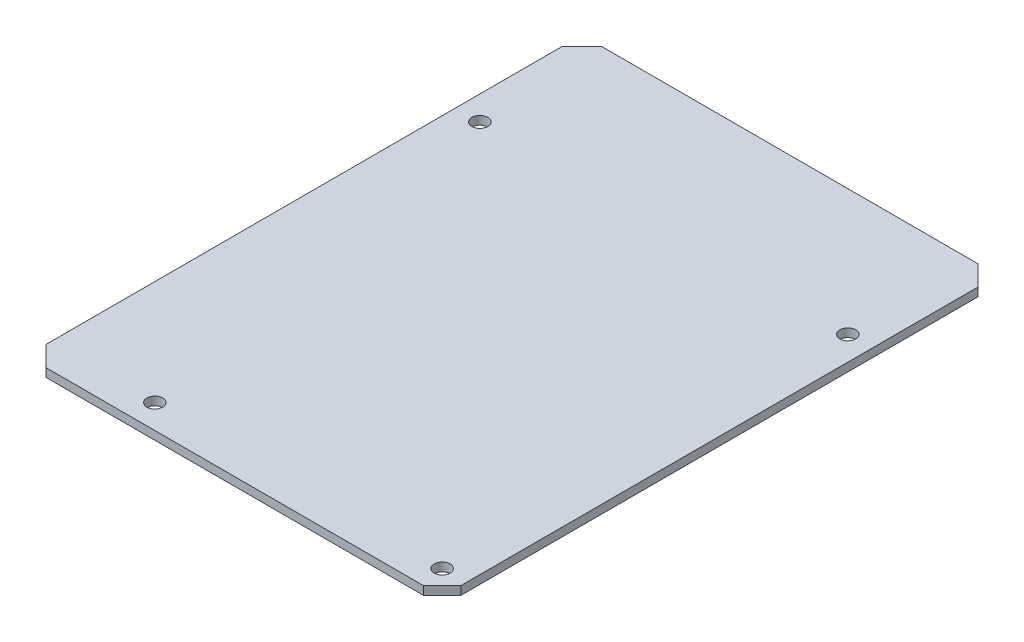
ISO-10303-21;
HEADER;
FILE_DESCRIPTION(('STEP AP214'),'2;1');
FILE_NAME('part.step','',(''),(''),'','','');
FILE_SCHEMA(('AUTOMOTIVE_DESIGN { 1 0 10303 214 1 1 1 1 }'));
ENDSEC;
DATA;
#1=APPLICATION_CONTEXT('core data for automotive mechanical design processes');
#2=APPLICATION_PROTOCOL_DEFINITION('international standard','automotive_design',2000,#1);
#3=PRODUCT_CONTEXT('',#1,'mechanical');
#4=PRODUCT('Part','Part','',(#3));
#5=PRODUCT_RELATED_PRODUCT_CATEGORY('part','',(#4));
#6=PRODUCT_DEFINITION_FORMATION('','',#4);
#7=PRODUCT_DEFINITION_CONTEXT('part definition',#1,'design');
#8=PRODUCT_DEFINITION('design','',#6,#7);
#9=PRODUCT_DEFINITION_SHAPE('','',#8);
#10=(LENGTH_UNIT() NAMED_UNIT(*) SI_UNIT(.MILLI.,.METRE.));
#11=(NAMED_UNIT(*) PLANE_ANGLE_UNIT() SI_UNIT($,.RADIAN.));
#12=(NAMED_UNIT(*) SI_UNIT($,.STERADIAN.) SOLID_ANGLE_UNIT());
#13=UNCERTAINTY_MEASURE_WITH_UNIT(LENGTH_MEASURE(1.E-05),#10,'distance_accuracy_value','');
#14=(GEOMETRIC_REPRESENTATION_CONTEXT(3) GLOBAL_UNCERTAINTY_ASSIGNED_CONTEXT((#13)) GLOBAL_UNIT_ASSIGNED_CONTEXT((#10,
#11,#12)) REPRESENTATION_CONTEXT('',''));
#15=CARTESIAN_POINT('',(0.,0.,0.));
#16=DIRECTION('',(0.,0.,1.));
#17=DIRECTION('',(1.,0.,0.));
#18=AXIS2_PLACEMENT_3D('',#15,#16,#17);
#19=CARTESIAN_POINT('',(0.,1.6,0.));
#20=DIRECTION('',(0.,1.,0.));
#21=DIRECTION('',(0.,0.,1.));
#22=AXIS2_PLACEMENT_3D('',#19,#20,#21);
#23=PLANE('',#22);
#24=CARTESIAN_POINT('',(-19.55,1.6,48.008));
#25=DIRECTION('',(0.,1.,0.));
#26=DIRECTION('',(0.,0.,1.));
#27=AXIS2_PLACEMENT_3D('',#24,#25,#26);
#28=CIRCLE('',#27,1.5);
#29=CARTESIAN_POINT('',(-19.55,1.6,49.508));
#30=VERTEX_POINT('',#29);
#31=EDGE_CURVE('E192',#30,#30,#28,.T.);
#32=ORIENTED_EDGE('',*,*,#31,.F.);
#33=EDGE_LOOP('',(#32));
#34=FACE_BOUND('',#33,.T.);
#35=CARTESIAN_POINT('',(-34.79,1.6,-28.702));
#36=DIRECTION('',(0.,1.,0.));
#37=DIRECTION('',(0.,0.,1.));
#38=AXIS2_PLACEMENT_3D('',#35,#36,#37);
#39=CIRCLE('',#38,1.5);
#40=CARTESIAN_POINT('',(-34.79,1.6,-27.202));
#41=VERTEX_POINT('',#40);
#42=EDGE_CURVE('E138',#41,#41,#39,.T.);
#43=ORIENTED_EDGE('',*,*,#42,.F.);
#44=EDGE_LOOP('',(#43));
#45=FACE_BOUND('',#44,.T.);
#46=DIRECTION('',(0.,0.,1.));
#47=VECTOR('',#46,1.);
#48=CARTESIAN_POINT('',(-39.37,1.6,-48.77));
#49=LINE('',#48,#47);
#50=CARTESIAN_POINT('',(-39.37,1.6,-48.77));
#51=VERTEX_POINT('',#50);
#52=CARTESIAN_POINT('',(-39.37,1.6,48.77));
#53=VERTEX_POINT('',#52);
#54=EDGE_CURVE('E149',#51,#53,#49,.T.);
#55=ORIENTED_EDGE('',*,*,#54,.T.);
#56=DIRECTION('',(0.70710678118655,0.,0.707106781186545));
#57=VECTOR('',#56,1.);
#58=CARTESIAN_POINT('',(-39.37,1.6,48.77));
#59=LINE('',#58,#57);
#60=CARTESIAN_POINT('',(-35.56,1.6,52.58));
#61=VERTEX_POINT('',#60);
#62=EDGE_CURVE('E97',#53,#61,#59,.T.);
#63=ORIENTED_EDGE('',*,*,#62,.T.);
#64=DIRECTION('',(1.,0.,0.));
#65=VECTOR('',#64,1.);
#66=CARTESIAN_POINT('',(-35.56,1.6,52.58));
#67=LINE('',#66,#65);
#68=CARTESIAN_POINT('',(35.814,1.6,52.58));
#69=VERTEX_POINT('',#68);
#70=EDGE_CURVE('E164',#61,#69,#67,.T.);
#71=ORIENTED_EDGE('',*,*,#70,.T.);
#72=DIRECTION('',(0.707106781186545,0.,-0.70710678118655));
#73=VECTOR('',#72,1.);
#74=CARTESIAN_POINT('',(39.37,1.6,49.024));
#75=LINE('',#74,#73);
#76=CARTESIAN_POINT('',(39.37,1.6,49.024));
#77=VERTEX_POINT('',#76);
#78=EDGE_CURVE('E177',#69,#77,#75,.T.);
#79=ORIENTED_EDGE('',*,*,#78,.T.);
#80=DIRECTION('',(0.,0.,-1.));
#81=VECTOR('',#80,1.);
#82=CARTESIAN_POINT('',(39.37,1.6,-48.77));
#83=LINE('',#82,#81);
#84=CARTESIAN_POINT('',(39.37,1.6,-48.77));
#85=VERTEX_POINT('',#84);
#86=EDGE_CURVE('E116',#77,#85,#83,.T.);
#87=ORIENTED_EDGE('',*,*,#86,.T.);
#88=DIRECTION('',(-0.707106781186547,0.,-0.707106781186547));
#89=VECTOR('',#88,1.);
#90=CARTESIAN_POINT('',(35.56,1.6,-52.58));
#91=LINE('',#90,#89);
#92=CARTESIAN_POINT('',(35.56,1.6,-52.58));
#93=VERTEX_POINT('',#92);
#94=EDGE_CURVE('E110',#85,#93,#91,.T.);
#95=ORIENTED_EDGE('',*,*,#94,.T.);
#96=DIRECTION('',(-1.,0.,0.));
#97=VECTOR('',#96,1.);
#98=CARTESIAN_POINT('',(-35.56,1.6,-52.58));
#99=LINE('',#98,#97);
#100=CARTESIAN_POINT('',(-35.56,1.6,-52.58));
#101=VERTEX_POINT('',#100);
#102=EDGE_CURVE('E114',#93,#101,#99,.T.);
#103=ORIENTED_EDGE('',*,*,#102,.T.);
#104=DIRECTION('',(-0.707106781186547,0.,0.707106781186547));
#105=VECTOR('',#104,1.);
#106=CARTESIAN_POINT('',(-35.56,1.6,-52.58));
#107=LINE('',#106,#105);
#108=EDGE_CURVE('E54',#101,#51,#107,.T.);
#109=ORIENTED_EDGE('',*,*,#108,.T.);
#110=EDGE_LOOP('',(#55,#63,#71,#79,#87,#95,#103,#109));
#111=FACE_BOUND('',#110,.T.);
#112=CARTESIAN_POINT('',(34.81,1.6,-28.702));
#113=DIRECTION('',(0.,1.,0.));
#114=DIRECTION('',(0.,0.,1.));
#115=AXIS2_PLACEMENT_3D('',#112,#113,#114);
#116=CIRCLE('',#115,1.5);
#117=CARTESIAN_POINT('',(34.81,1.6,-27.202));
#118=VERTEX_POINT('',#117);
#119=EDGE_CURVE('E186',#118,#118,#116,.T.);
#120=ORIENTED_EDGE('',*,*,#119,.F.);
#121=EDGE_LOOP('',(#120));
#122=FACE_BOUND('',#121,.T.);
#123=CARTESIAN_POINT('',(34.81,1.6,48.008));
#124=DIRECTION('',(0.,1.,0.));
#125=DIRECTION('',(0.,0.,1.));
#126=AXIS2_PLACEMENT_3D('',#123,#124,#125);
#127=CIRCLE('',#126,1.50000000000001);
#128=CARTESIAN_POINT('',(34.81,1.6,49.508));
#129=VERTEX_POINT('',#128);
#130=EDGE_CURVE('E198',#129,#129,#127,.T.);
#131=ORIENTED_EDGE('',*,*,#130,.F.);
#132=EDGE_LOOP('',(#131));
#133=FACE_BOUND('',#132,.T.);
#134=ADVANCED_FACE('F37',(#34,#45,#111,#122,#133),#23,.T.);
#135=CARTESIAN_POINT('',(0.,0.,0.));
#136=DIRECTION('',(0.,1.,0.));
#137=DIRECTION('',(0.,0.,1.));
#138=AXIS2_PLACEMENT_3D('',#135,#136,#137);
#139=PLANE('',#138);
#140=DIRECTION('',(0.,0.,1.));
#141=VECTOR('',#140,1.);
#142=CARTESIAN_POINT('',(-39.37,0.,-48.77));
#143=LINE('',#142,#141);
#144=CARTESIAN_POINT('',(-39.37,0.,-48.77));
#145=VERTEX_POINT('',#144);
#146=CARTESIAN_POINT('',(-39.37,0.,48.77));
#147=VERTEX_POINT('',#146);
#148=EDGE_CURVE('E134',#145,#147,#143,.T.);
#149=ORIENTED_EDGE('',*,*,#148,.F.);
#150=DIRECTION('',(-0.707106781186547,0.,0.707106781186547));
#151=VECTOR('',#150,1.);
#152=CARTESIAN_POINT('',(-35.56,0.,-52.58));
#153=LINE('',#152,#151);
#154=CARTESIAN_POINT('',(-35.56,0.,-52.58));
#155=VERTEX_POINT('',#154);
#156=EDGE_CURVE('E89',#155,#145,#153,.T.);
#157=ORIENTED_EDGE('',*,*,#156,.F.);
#158=DIRECTION('',(-1.,0.,0.));
#159=VECTOR('',#158,1.);
#160=CARTESIAN_POINT('',(-35.56,0.,-52.58));
#161=LINE('',#160,#159);
#162=CARTESIAN_POINT('',(35.56,0.,-52.58));
#163=VERTEX_POINT('',#162);
#164=EDGE_CURVE('E83',#163,#155,#161,.T.);
#165=ORIENTED_EDGE('',*,*,#164,.F.);
#166=DIRECTION('',(-0.707106781186547,0.,-0.707106781186547));
#167=VECTOR('',#166,1.);
#168=CARTESIAN_POINT('',(35.56,0.,-52.58));
#169=LINE('',#168,#167);
#170=CARTESIAN_POINT('',(39.37,0.,-48.77));
#171=VERTEX_POINT('',#170);
#172=EDGE_CURVE('E124',#171,#163,#169,.T.);
#173=ORIENTED_EDGE('',*,*,#172,.F.);
#174=DIRECTION('',(0.,0.,-1.));
#175=VECTOR('',#174,1.);
#176=CARTESIAN_POINT('',(39.37,0.,-48.77));
#177=LINE('',#176,#175);
#178=CARTESIAN_POINT('',(39.37,0.,49.024));
#179=VERTEX_POINT('',#178);
#180=EDGE_CURVE('E144',#179,#171,#177,.T.);
#181=ORIENTED_EDGE('',*,*,#180,.F.);
#182=DIRECTION('',(0.707106781186545,0.,-0.70710678118655));
#183=VECTOR('',#182,1.);
#184=CARTESIAN_POINT('',(39.37,0.,49.024));
#185=LINE('',#184,#183);
#186=CARTESIAN_POINT('',(35.814,0.,52.58));
#187=VERTEX_POINT('',#186);
#188=EDGE_CURVE('E142',#187,#179,#185,.T.);
#189=ORIENTED_EDGE('',*,*,#188,.F.);
#190=DIRECTION('',(1.,0.,0.));
#191=VECTOR('',#190,1.);
#192=CARTESIAN_POINT('',(-35.56,0.,52.58));
#193=LINE('',#192,#191);
#194=CARTESIAN_POINT('',(-35.56,0.,52.58));
#195=VERTEX_POINT('',#194);
#196=EDGE_CURVE('E140',#195,#187,#193,.T.);
#197=ORIENTED_EDGE('',*,*,#196,.F.);
#198=DIRECTION('',(0.70710678118655,0.,0.707106781186545));
#199=VECTOR('',#198,1.);
#200=CARTESIAN_POINT('',(-39.37,0.,48.77));
#201=LINE('',#200,#199);
#202=EDGE_CURVE('E137',#147,#195,#201,.T.);
#203=ORIENTED_EDGE('',*,*,#202,.F.);
#204=EDGE_LOOP('',(#149,#157,#165,#173,#181,#189,#197,#203));
#205=FACE_BOUND('',#204,.T.);
#206=CARTESIAN_POINT('',(-34.79,0.,-28.702));
#207=DIRECTION('',(0.,1.,0.));
#208=DIRECTION('',(0.,0.,1.));
#209=AXIS2_PLACEMENT_3D('',#206,#207,#208);
#210=CIRCLE('',#209,1.5);
#211=CARTESIAN_POINT('',(-34.79,0.,-27.202));
#212=VERTEX_POINT('',#211);
#213=EDGE_CURVE('E183',#212,#212,#210,.T.);
#214=ORIENTED_EDGE('',*,*,#213,.T.);
#215=EDGE_LOOP('',(#214));
#216=FACE_BOUND('',#215,.T.);
#217=CARTESIAN_POINT('',(34.81,0.,-28.702));
#218=DIRECTION('',(0.,1.,0.));
#219=DIRECTION('',(0.,0.,1.));
#220=AXIS2_PLACEMENT_3D('',#217,#218,#219);
#221=CIRCLE('',#220,1.5);
#222=CARTESIAN_POINT('',(34.81,0.,-27.202));
#223=VERTEX_POINT('',#222);
#224=EDGE_CURVE('E189',#223,#223,#221,.T.);
#225=ORIENTED_EDGE('',*,*,#224,.T.);
#226=EDGE_LOOP('',(#225));
#227=FACE_BOUND('',#226,.T.);
#228=CARTESIAN_POINT('',(-19.55,0.,48.008));
#229=DIRECTION('',(0.,1.,0.));
#230=DIRECTION('',(0.,0.,1.));
#231=AXIS2_PLACEMENT_3D('',#228,#229,#230);
#232=CIRCLE('',#231,1.5);
#233=CARTESIAN_POINT('',(-19.55,0.,49.508));
#234=VERTEX_POINT('',#233);
#235=EDGE_CURVE('E195',#234,#234,#232,.T.);
#236=ORIENTED_EDGE('',*,*,#235,.T.);
#237=EDGE_LOOP('',(#236));
#238=FACE_BOUND('',#237,.T.);
#239=CARTESIAN_POINT('',(34.81,0.,48.008));
#240=DIRECTION('',(0.,1.,0.));
#241=DIRECTION('',(0.,0.,1.));
#242=AXIS2_PLACEMENT_3D('',#239,#240,#241);
#243=CIRCLE('',#242,1.50000000000001);
#244=CARTESIAN_POINT('',(34.81,0.,49.508));
#245=VERTEX_POINT('',#244);
#246=EDGE_CURVE('E201',#245,#245,#243,.T.);
#247=ORIENTED_EDGE('',*,*,#246,.T.);
#248=EDGE_LOOP('',(#247));
#249=FACE_BOUND('',#248,.T.);
#250=ADVANCED_FACE('F168',(#205,#216,#227,#238,#249),#139,.F.);
#251=CARTESIAN_POINT('',(-39.37,1.6,-48.77));
#252=DIRECTION('',(1.,0.,0.));
#253=DIRECTION('',(0.,0.,-1.));
#254=AXIS2_PLACEMENT_3D('',#251,#252,#253);
#255=PLANE('',#254);
#256=ORIENTED_EDGE('',*,*,#148,.T.);
#257=DIRECTION('',(0.,-1.,0.));
#258=VECTOR('',#257,1.);
#259=CARTESIAN_POINT('',(-39.37,1.6,48.77));
#260=LINE('',#259,#258);
#261=EDGE_CURVE('E11',#53,#147,#260,.T.);
#262=ORIENTED_EDGE('',*,*,#261,.F.);
#263=ORIENTED_EDGE('',*,*,#54,.F.);
#264=DIRECTION('',(0.,-1.,0.));
#265=VECTOR('',#264,1.);
#266=CARTESIAN_POINT('',(-39.37,1.6,-48.77));
#267=LINE('',#266,#265);
#268=EDGE_CURVE('E130',#51,#145,#267,.T.);
#269=ORIENTED_EDGE('',*,*,#268,.T.);
#270=EDGE_LOOP('',(#256,#262,#263,#269));
#271=FACE_BOUND('',#270,.T.);
#272=ADVANCED_FACE('F39',(#271),#255,.F.);
#273=CARTESIAN_POINT('',(-39.37,1.6,48.77));
#274=DIRECTION('',(0.707106781186545,0.,-0.70710678118655));
#275=DIRECTION('',(-0.70710678118655,0.,-0.707106781186545));
#276=AXIS2_PLACEMENT_3D('',#273,#274,#275);
#277=PLANE('',#276);
#278=ORIENTED_EDGE('',*,*,#202,.T.);
#279=DIRECTION('',(0.,-1.,0.));
#280=VECTOR('',#279,1.);
#281=CARTESIAN_POINT('',(-35.56,1.6,52.58));
#282=LINE('',#281,#280);
#283=EDGE_CURVE('E46',#61,#195,#282,.T.);
#284=ORIENTED_EDGE('',*,*,#283,.F.);
#285=ORIENTED_EDGE('',*,*,#62,.F.);
#286=ORIENTED_EDGE('',*,*,#261,.T.);
#287=EDGE_LOOP('',(#278,#284,#285,#286));
#288=FACE_BOUND('',#287,.T.);
#289=ADVANCED_FACE('F235',(#288),#277,.F.);
#290=CARTESIAN_POINT('',(-35.56,1.6,52.58));
#291=DIRECTION('',(0.,0.,-1.));
#292=DIRECTION('',(-1.,0.,0.));
#293=AXIS2_PLACEMENT_3D('',#290,#291,#292);
#294=PLANE('',#293);
#295=ORIENTED_EDGE('',*,*,#196,.T.);
#296=DIRECTION('',(0.,-1.,0.));
#297=VECTOR('',#296,1.);
#298=CARTESIAN_POINT('',(35.814,1.6,52.58));
#299=LINE('',#298,#297);
#300=EDGE_CURVE('E156',#69,#187,#299,.T.);
#301=ORIENTED_EDGE('',*,*,#300,.F.);
#302=ORIENTED_EDGE('',*,*,#70,.F.);
#303=ORIENTED_EDGE('',*,*,#283,.T.);
#304=EDGE_LOOP('',(#295,#301,#302,#303));
#305=FACE_BOUND('',#304,.T.);
#306=ADVANCED_FACE('F162',(#305),#294,.F.);
#307=CARTESIAN_POINT('',(39.37,1.6,49.024));
#308=DIRECTION('',(-0.70710678118655,0.,-0.707106781186545));
#309=DIRECTION('',(-0.707106781186545,0.,0.70710678118655));
#310=AXIS2_PLACEMENT_3D('',#307,#308,#309);
#311=PLANE('',#310);
#312=ORIENTED_EDGE('',*,*,#188,.T.);
#313=DIRECTION('',(0.,-1.,0.));
#314=VECTOR('',#313,1.);
#315=CARTESIAN_POINT('',(39.37,1.6,49.024));
#316=LINE('',#315,#314);
#317=EDGE_CURVE('E153',#77,#179,#316,.T.);
#318=ORIENTED_EDGE('',*,*,#317,.F.);
#319=ORIENTED_EDGE('',*,*,#78,.F.);
#320=ORIENTED_EDGE('',*,*,#300,.T.);
#321=EDGE_LOOP('',(#312,#318,#319,#320));
#322=FACE_BOUND('',#321,.T.);
#323=ADVANCED_FACE('F173',(#322),#311,.F.);
#324=CARTESIAN_POINT('',(39.37,1.6,-48.77));
#325=DIRECTION('',(-1.,0.,0.));
#326=DIRECTION('',(0.,0.,1.));
#327=AXIS2_PLACEMENT_3D('',#324,#325,#326);
#328=PLANE('',#327);
#329=ORIENTED_EDGE('',*,*,#180,.T.);
#330=DIRECTION('',(0.,-1.,0.));
#331=VECTOR('',#330,1.);
#332=CARTESIAN_POINT('',(39.37,1.6,-48.77));
#333=LINE('',#332,#331);
#334=EDGE_CURVE('E125',#85,#171,#333,.T.);
#335=ORIENTED_EDGE('',*,*,#334,.F.);
#336=ORIENTED_EDGE('',*,*,#86,.F.);
#337=ORIENTED_EDGE('',*,*,#317,.T.);
#338=EDGE_LOOP('',(#329,#335,#336,#337));
#339=FACE_BOUND('',#338,.T.);
#340=ADVANCED_FACE('F176',(#339),#328,.F.);
#341=CARTESIAN_POINT('',(35.56,1.6,-52.58));
#342=DIRECTION('',(-0.707106781186548,0.,0.707106781186548));
#343=DIRECTION('',(0.707106781186548,0.,0.707106781186548));
#344=AXIS2_PLACEMENT_3D('',#341,#342,#343);
#345=PLANE('',#344);
#346=ORIENTED_EDGE('',*,*,#172,.T.);
#347=DIRECTION('',(0.,-1.,0.));
#348=VECTOR('',#347,1.);
#349=CARTESIAN_POINT('',(35.56,1.6,-52.58));
#350=LINE('',#349,#348);
#351=EDGE_CURVE('E121',#93,#163,#350,.T.);
#352=ORIENTED_EDGE('',*,*,#351,.F.);
#353=ORIENTED_EDGE('',*,*,#94,.F.);
#354=ORIENTED_EDGE('',*,*,#334,.T.);
#355=EDGE_LOOP('',(#346,#352,#353,#354));
#356=FACE_BOUND('',#355,.T.);
#357=ADVANCED_FACE('F122',(#356),#345,.F.);
#358=CARTESIAN_POINT('',(-35.56,1.6,-52.58));
#359=DIRECTION('',(0.,0.,1.));
#360=DIRECTION('',(1.,0.,0.));
#361=AXIS2_PLACEMENT_3D('',#358,#359,#360);
#362=PLANE('',#361);
#363=ORIENTED_EDGE('',*,*,#164,.T.);
#364=DIRECTION('',(0.,-1.,0.));
#365=VECTOR('',#364,1.);
#366=CARTESIAN_POINT('',(-35.56,1.6,-52.58));
#367=LINE('',#366,#365);
#368=EDGE_CURVE('E126',#101,#155,#367,.T.);
#369=ORIENTED_EDGE('',*,*,#368,.F.);
#370=ORIENTED_EDGE('',*,*,#102,.F.);
#371=ORIENTED_EDGE('',*,*,#351,.T.);
#372=EDGE_LOOP('',(#363,#369,#370,#371));
#373=FACE_BOUND('',#372,.T.);
#374=ADVANCED_FACE('F128',(#373),#362,.F.);
#375=CARTESIAN_POINT('',(-35.56,1.6,-52.58));
#376=DIRECTION('',(0.707106781186548,0.,0.707106781186548));
#377=DIRECTION('',(0.707106781186548,0.,-0.707106781186548));
#378=AXIS2_PLACEMENT_3D('',#375,#376,#377);
#379=PLANE('',#378);
#380=ORIENTED_EDGE('',*,*,#156,.T.);
#381=ORIENTED_EDGE('',*,*,#268,.F.);
#382=ORIENTED_EDGE('',*,*,#108,.F.);
#383=ORIENTED_EDGE('',*,*,#368,.T.);
#384=EDGE_LOOP('',(#380,#381,#382,#383));
#385=FACE_BOUND('',#384,.T.);
#386=ADVANCED_FACE('F223',(#385),#379,.F.);
#387=CARTESIAN_POINT('',(-34.79,1.6,-28.702));
#388=DIRECTION('',(0.,-1.,0.));
#389=DIRECTION('',(0.,0.,-1.));
#390=AXIS2_PLACEMENT_3D('',#387,#388,#389);
#391=CYLINDRICAL_SURFACE('',#390,1.5);
#392=ORIENTED_EDGE('',*,*,#42,.T.);
#393=EDGE_LOOP('',(#392));
#394=FACE_BOUND('',#393,.T.);
#395=ORIENTED_EDGE('',*,*,#213,.F.);
#396=EDGE_LOOP('',(#395));
#397=FACE_BOUND('',#396,.T.);
#398=ADVANCED_FACE('F220',(#394,#397),#391,.F.);
#399=CARTESIAN_POINT('',(34.81,1.6,-28.702));
#400=DIRECTION('',(0.,-1.,0.));
#401=DIRECTION('',(0.,0.,-1.));
#402=AXIS2_PLACEMENT_3D('',#399,#400,#401);
#403=CYLINDRICAL_SURFACE('',#402,1.5);
#404=ORIENTED_EDGE('',*,*,#119,.T.);
#405=EDGE_LOOP('',(#404));
#406=FACE_BOUND('',#405,.T.);
#407=ORIENTED_EDGE('',*,*,#224,.F.);
#408=EDGE_LOOP('',(#407));
#409=FACE_BOUND('',#408,.T.);
#410=ADVANCED_FACE('F311',(#406,#409),#403,.F.);
#411=CARTESIAN_POINT('',(-19.55,1.6,48.008));
#412=DIRECTION('',(0.,-1.,0.));
#413=DIRECTION('',(0.,0.,-1.));
#414=AXIS2_PLACEMENT_3D('',#411,#412,#413);
#415=CYLINDRICAL_SURFACE('',#414,1.5);
#416=ORIENTED_EDGE('',*,*,#31,.T.);
#417=EDGE_LOOP('',(#416));
#418=FACE_BOUND('',#417,.T.);
#419=ORIENTED_EDGE('',*,*,#235,.F.);
#420=EDGE_LOOP('',(#419));
#421=FACE_BOUND('',#420,.T.);
#422=ADVANCED_FACE('F320',(#418,#421),#415,.F.);
#423=CARTESIAN_POINT('',(34.81,1.6,48.008));
#424=DIRECTION('',(0.,-1.,0.));
#425=DIRECTION('',(0.,0.,-1.));
#426=AXIS2_PLACEMENT_3D('',#423,#424,#425);
#427=CYLINDRICAL_SURFACE('',#426,1.50000000000001);
#428=ORIENTED_EDGE('',*,*,#130,.T.);
#429=EDGE_LOOP('',(#428));
#430=FACE_BOUND('',#429,.T.);
#431=ORIENTED_EDGE('',*,*,#246,.F.);
#432=EDGE_LOOP('',(#431));
#433=FACE_BOUND('',#432,.T.);
#434=ADVANCED_FACE('F207',(#430,#433),#427,.F.);
#435=CLOSED_SHELL('',(#134,#250,#272,#289,#306,#323,#340,#357,#374,#386,#398,#410,#422,#434));
#436=MANIFOLD_SOLID_BREP('B2',#435);
#437=ADVANCED_BREP_SHAPE_REPRESENTATION('',(#18,#436),#14);
#438=SHAPE_DEFINITION_REPRESENTATION(#9,#437);
ENDSEC;
END-ISO-10303-21;
